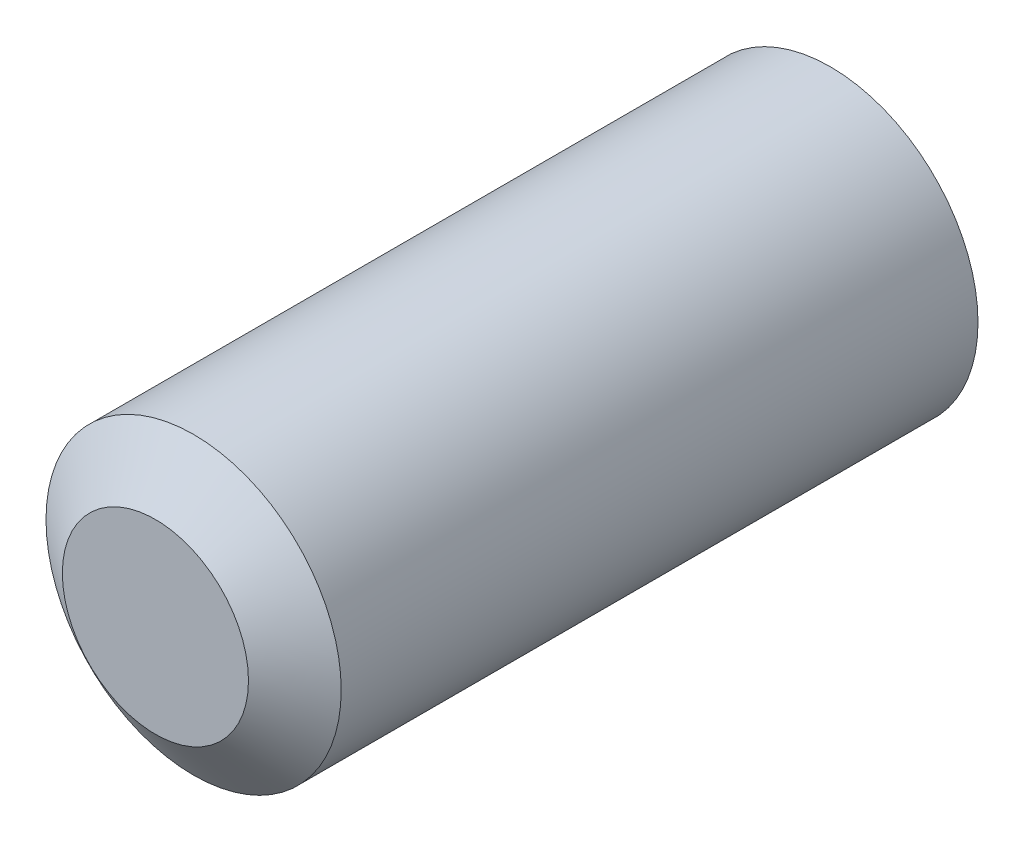
ISO-10303-21;
HEADER;
FILE_DESCRIPTION(('STEP AP214'),'2;1');
FILE_NAME('part.step','',(''),(''),'','','');
FILE_SCHEMA(('AUTOMOTIVE_DESIGN { 1 0 10303 214 1 1 1 1 }'));
ENDSEC;
DATA;
#1=APPLICATION_CONTEXT('core data for automotive mechanical design processes');
#2=APPLICATION_PROTOCOL_DEFINITION('international standard','automotive_design',2000,#1);
#3=PRODUCT_CONTEXT('',#1,'mechanical');
#4=PRODUCT('Part','Part','',(#3));
#5=PRODUCT_RELATED_PRODUCT_CATEGORY('part','',(#4));
#6=PRODUCT_DEFINITION_FORMATION('','',#4);
#7=PRODUCT_DEFINITION_CONTEXT('part definition',#1,'design');
#8=PRODUCT_DEFINITION('design','',#6,#7);
#9=PRODUCT_DEFINITION_SHAPE('','',#8);
#10=(LENGTH_UNIT() NAMED_UNIT(*) SI_UNIT(.MILLI.,.METRE.));
#11=(NAMED_UNIT(*) PLANE_ANGLE_UNIT() SI_UNIT($,.RADIAN.));
#12=(NAMED_UNIT(*) SI_UNIT($,.STERADIAN.) SOLID_ANGLE_UNIT());
#13=UNCERTAINTY_MEASURE_WITH_UNIT(LENGTH_MEASURE(1.E-05),#10,'distance_accuracy_value','');
#14=(GEOMETRIC_REPRESENTATION_CONTEXT(3) GLOBAL_UNCERTAINTY_ASSIGNED_CONTEXT((#13)) GLOBAL_UNIT_ASSIGNED_CONTEXT((#10,
#11,#12)) REPRESENTATION_CONTEXT('',''));
#15=CARTESIAN_POINT('',(0.,0.,0.));
#16=DIRECTION('',(0.,0.,1.));
#17=DIRECTION('',(1.,0.,0.));
#18=AXIS2_PLACEMENT_3D('',#15,#16,#17);
#19=CARTESIAN_POINT('',(0.,0.,9.525));
#20=DIRECTION('',(0.,0.,-1.));
#21=DIRECTION('',(-1.,0.,0.));
#22=AXIS2_PLACEMENT_3D('',#19,#20,#21);
#23=CYLINDRICAL_SURFACE('',#22,2.0828);
#24=CARTESIAN_POINT('',(0.,0.,8.98615127117986));
#25=DIRECTION('',(0.,0.,-1.));
#26=DIRECTION('',(-1.,0.,0.));
#27=AXIS2_PLACEMENT_3D('',#24,#25,#26);
#28=CIRCLE('',#27,2.0828);
#29=CARTESIAN_POINT('',(-2.0828,0.,8.98615127117986));
#30=VERTEX_POINT('',#29);
#31=EDGE_CURVE('E49',#30,#30,#28,.T.);
#32=CARTESIAN_POINT('',(0.,0.,0.));
#33=DIRECTION('',(0.,0.,1.));
#34=DIRECTION('',(1.,0.,0.));
#35=AXIS2_PLACEMENT_3D('',#32,#33,#34);
#36=CIRCLE('',#35,2.0828);
#37=CARTESIAN_POINT('',(-2.0828,0.,0.));
#38=VERTEX_POINT('',#37);
#39=EDGE_CURVE('E10',#38,#38,#36,.T.);
#40=CARTESIAN_POINT('',(-2.0828,0.,8.98615127117986));
#41=CARTESIAN_POINT('',(-2.0828,0.,8.89254552877174));
#42=CARTESIAN_POINT('',(-2.0828,0.,8.79893978636361));
#43=CARTESIAN_POINT('',(-2.0828,0.,8.61172830154737));
#44=CARTESIAN_POINT('',(-2.0828,0.,8.51812255913924));
#45=CARTESIAN_POINT('',(-2.0828,0.,8.330911074323));
#46=CARTESIAN_POINT('',(-2.0828,0.,8.23730533191487));
#47=CARTESIAN_POINT('',(-2.0828,0.,8.05009384709862));
#48=CARTESIAN_POINT('',(-2.0828,0.,7.9564881046905));
#49=CARTESIAN_POINT('',(-2.0828,0.,7.76927661987425));
#50=CARTESIAN_POINT('',(-2.0828,0.,7.67567087746613));
#51=CARTESIAN_POINT('',(-2.0828,0.,7.48845939264988));
#52=CARTESIAN_POINT('',(-2.0828,0.,7.39485365024176));
#53=CARTESIAN_POINT('',(-2.0828,0.,7.20764216542551));
#54=CARTESIAN_POINT('',(-2.0828,0.,7.11403642301739));
#55=CARTESIAN_POINT('',(-2.0828,0.,6.92682493820114));
#56=CARTESIAN_POINT('',(-2.0828,0.,6.83321919579302));
#57=CARTESIAN_POINT('',(-2.0828,0.,6.64600771097677));
#58=CARTESIAN_POINT('',(-2.0828,0.,6.55240196856865));
#59=CARTESIAN_POINT('',(-2.0828,0.,6.3651904837524));
#60=CARTESIAN_POINT('',(-2.0828,0.,6.27158474134428));
#61=CARTESIAN_POINT('',(-2.0828,0.,6.08437325652803));
#62=CARTESIAN_POINT('',(-2.0828,0.,5.99076751411991));
#63=CARTESIAN_POINT('',(-2.0828,0.,5.80355602930366));
#64=CARTESIAN_POINT('',(-2.0828,0.,5.70995028689554));
#65=CARTESIAN_POINT('',(-2.0828,0.,5.52273880207929));
#66=CARTESIAN_POINT('',(-2.0828,0.,5.42913305967117));
#67=CARTESIAN_POINT('',(-2.0828,0.,5.24192157485492));
#68=CARTESIAN_POINT('',(-2.0828,0.,5.1483158324468));
#69=CARTESIAN_POINT('',(-2.0828,0.,4.96110434763055));
#70=CARTESIAN_POINT('',(-2.0828,0.,4.86749860522242));
#71=CARTESIAN_POINT('',(-2.0828,0.,4.68028712040618));
#72=CARTESIAN_POINT('',(-2.0828,0.,4.58668137799805));
#73=CARTESIAN_POINT('',(-2.0828,0.,4.39946989318181));
#74=CARTESIAN_POINT('',(-2.0828,0.,4.30586415077368));
#75=CARTESIAN_POINT('',(-2.0828,0.,4.11865266595744));
#76=CARTESIAN_POINT('',(-2.0828,0.,4.02504692354931));
#77=CARTESIAN_POINT('',(-2.0828,0.,3.83783543873307));
#78=CARTESIAN_POINT('',(-2.0828,0.,3.74422969632494));
#79=CARTESIAN_POINT('',(-2.0828,0.,3.55701821150869));
#80=CARTESIAN_POINT('',(-2.0828,0.,3.46341246910057));
#81=CARTESIAN_POINT('',(-2.0828,0.,3.27620098428432));
#82=CARTESIAN_POINT('',(-2.0828,0.,3.1825952418762));
#83=CARTESIAN_POINT('',(-2.0828,0.,2.99538375705995));
#84=CARTESIAN_POINT('',(-2.0828,0.,2.90177801465183));
#85=CARTESIAN_POINT('',(-2.0828,0.,2.71456652983558));
#86=CARTESIAN_POINT('',(-2.0828,0.,2.62096078742746));
#87=CARTESIAN_POINT('',(-2.0828,0.,2.43374930261121));
#88=CARTESIAN_POINT('',(-2.0828,0.,2.34014356020309));
#89=CARTESIAN_POINT('',(-2.0828,0.,2.15293207538684));
#90=CARTESIAN_POINT('',(-2.0828,0.,2.05932633297872));
#91=CARTESIAN_POINT('',(-2.0828,0.,1.87211484816247));
#92=CARTESIAN_POINT('',(-2.0828,0.,1.77850910575435));
#93=CARTESIAN_POINT('',(-2.0828,0.,1.5912976209381));
#94=CARTESIAN_POINT('',(-2.0828,0.,1.49769187852998));
#95=CARTESIAN_POINT('',(-2.0828,0.,1.31048039371373));
#96=CARTESIAN_POINT('',(-2.0828,0.,1.21687465130561));
#97=CARTESIAN_POINT('',(-2.0828,0.,1.02966316648936));
#98=CARTESIAN_POINT('',(-2.0828,0.,0.936057424081235));
#99=CARTESIAN_POINT('',(-2.0828,0.,0.748845939264988));
#100=CARTESIAN_POINT('',(-2.0828,0.,0.655240196856864));
#101=CARTESIAN_POINT('',(-2.0828,0.,0.468028712040617));
#102=CARTESIAN_POINT('',(-2.0828,0.,0.374422969632494));
#103=CARTESIAN_POINT('',(-2.0828,0.,0.187211484816247));
#104=CARTESIAN_POINT('',(-2.0828,0.,0.0936057424081236));
#105=CARTESIAN_POINT('',(-2.0828,0.,0.));
#106=B_SPLINE_CURVE_WITH_KNOTS('',3,(#40,#41,#42,#43,#44,#45,#46,#47,#48,#49,#50,#51,#52,#53,
#54,#55,#56,#57,#58,#59,#60,#61,#62,#63,#64,#65,#66,#67,#68,#69,#70,#71,#72,#73,#74,#75,#76,#77,
#78,#79,#80,#81,#82,#83,#84,#85,#86,#87,#88,#89,#90,#91,#92,#93,#94,#95,#96,#97,#98,#99,#100,
#101,#102,#103,#104,#105),.UNSPECIFIED.,.F.,.F.,(4,2,2,2,2,2,2,2,2,2,2,2,2,2,2,2,2,2,2,2,2,2,2,
2,2,2,2,2,2,2,2,2,4),(0.,0.28081722722437,0.561634454448741,0.842451681673111,1.12326890889748,
1.40408613612185,1.68490336334622,1.96572059057059,2.24653781779496,2.52735504501933,
2.80817227224371,3.08898949946808,3.36980672669245,3.65062395391682,3.93144118114119,
4.21225840836556,4.49307563558993,4.7738928628143,5.05471009003867,5.33552731726304,
5.61634454448741,5.89716177171178,6.17797899893615,6.45879622616052,6.73961345338489,
7.02043068060926,7.30124790783363,7.58206513505801,7.86288236228238,8.14369958950675,
8.42451681673112,8.70533404395549,8.98615127117986),.UNSPECIFIED.);
#107=EDGE_CURVE('BSEAM37',#30,#38,#106,.T.);
#108=ORIENTED_EDGE('',*,*,#31,.T.);
#109=ORIENTED_EDGE('',*,*,#39,.T.);
#110=ORIENTED_EDGE('',*,*,#107,.T.);
#111=ORIENTED_EDGE('',*,*,#107,.F.);
#112=EDGE_LOOP('',(#108,#110,#109,#111));
#113=FACE_BOUND('',#112,.T.);
#114=ADVANCED_FACE('F37',(#113),#23,.T.);
#115=CARTESIAN_POINT('',(0.,0.,0.));
#116=DIRECTION('',(0.,0.,1.));
#117=DIRECTION('',(1.,0.,0.));
#118=AXIS2_PLACEMENT_3D('',#115,#116,#117);
#119=PLANE('',#118);
#120=ORIENTED_EDGE('',*,*,#39,.F.);
#121=EDGE_LOOP('',(#120));
#122=FACE_BOUND('',#121,.T.);
#123=ADVANCED_FACE('F61',(#122),#119,.F.);
#124=CARTESIAN_POINT('',(0.,0.,9.525));
#125=DIRECTION('',(0.,0.,-1.));
#126=DIRECTION('',(-1.,0.,0.));
#127=AXIS2_PLACEMENT_3D('',#124,#125,#126);
#128=CONICAL_SURFACE('',#127,1.313244262,0.959931088596877);
#129=ORIENTED_EDGE('',*,*,#31,.F.);
#130=EDGE_LOOP('',(#129));
#131=FACE_BOUND('',#130,.T.);
#132=CARTESIAN_POINT('',(0.,0.,9.525));
#133=DIRECTION('',(0.,0.,-1.));
#134=DIRECTION('',(-1.,0.,0.));
#135=AXIS2_PLACEMENT_3D('',#132,#133,#134);
#136=CIRCLE('',#135,1.313244262);
#137=CARTESIAN_POINT('',(-1.313244262,0.,9.525));
#138=VERTEX_POINT('',#137);
#139=EDGE_CURVE('E44',#138,#138,#136,.T.);
#140=ORIENTED_EDGE('',*,*,#139,.T.);
#141=EDGE_LOOP('',(#140));
#142=FACE_BOUND('',#141,.T.);
#143=ADVANCED_FACE('F58',(#131,#142),#128,.T.);
#144=CARTESIAN_POINT('',(0.,0.,9.525));
#145=DIRECTION('',(0.,0.,1.));
#146=DIRECTION('',(1.,0.,0.));
#147=AXIS2_PLACEMENT_3D('',#144,#145,#146);
#148=PLANE('',#147);
#149=ORIENTED_EDGE('',*,*,#139,.F.);
#150=EDGE_LOOP('',(#149));
#151=FACE_BOUND('',#150,.T.);
#152=ADVANCED_FACE('F60',(#151),#148,.T.);
#153=CLOSED_SHELL('',(#114,#123,#143,#152));
#154=MANIFOLD_SOLID_BREP('B2',#153);
#155=ADVANCED_BREP_SHAPE_REPRESENTATION('',(#18,#154),#14);
#156=SHAPE_DEFINITION_REPRESENTATION(#9,#155);
ENDSEC;
END-ISO-10303-21;
